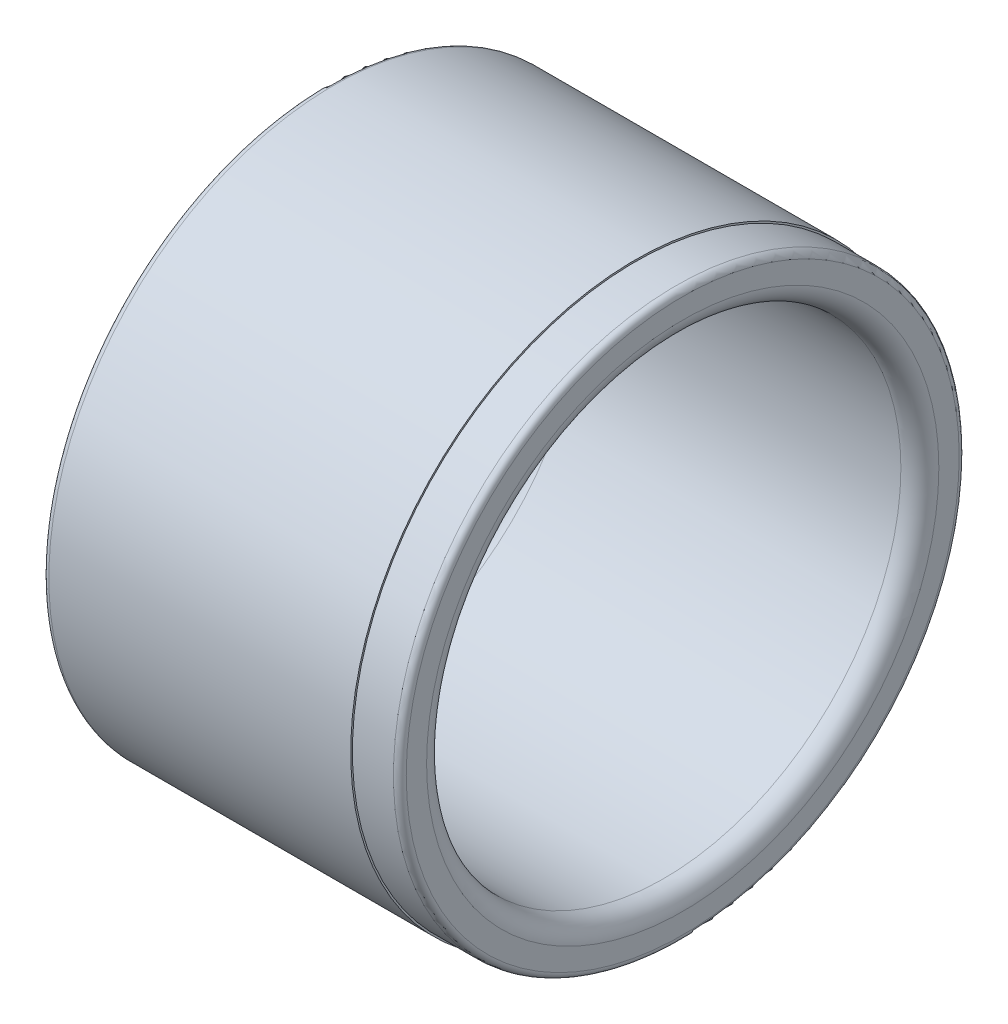
ISO-10303-21;
HEADER;
FILE_DESCRIPTION(('STEP AP214'),'2;1');
FILE_NAME('part.step','',(''),(''),'','','');
FILE_SCHEMA(('AUTOMOTIVE_DESIGN { 1 0 10303 214 1 1 1 1 }'));
ENDSEC;
DATA;
#1=APPLICATION_CONTEXT('core data for automotive mechanical design processes');
#2=APPLICATION_PROTOCOL_DEFINITION('international standard','automotive_design',2000,#1);
#3=PRODUCT_CONTEXT('',#1,'mechanical');
#4=PRODUCT('Part','Part','',(#3));
#5=PRODUCT_RELATED_PRODUCT_CATEGORY('part','',(#4));
#6=PRODUCT_DEFINITION_FORMATION('','',#4);
#7=PRODUCT_DEFINITION_CONTEXT('part definition',#1,'design');
#8=PRODUCT_DEFINITION('design','',#6,#7);
#9=PRODUCT_DEFINITION_SHAPE('','',#8);
#10=(LENGTH_UNIT() NAMED_UNIT(*) SI_UNIT(.MILLI.,.METRE.));
#11=(NAMED_UNIT(*) PLANE_ANGLE_UNIT() SI_UNIT($,.RADIAN.));
#12=(NAMED_UNIT(*) SI_UNIT($,.STERADIAN.) SOLID_ANGLE_UNIT());
#13=UNCERTAINTY_MEASURE_WITH_UNIT(LENGTH_MEASURE(1.E-05),#10,'distance_accuracy_value','');
#14=(GEOMETRIC_REPRESENTATION_CONTEXT(3) GLOBAL_UNCERTAINTY_ASSIGNED_CONTEXT((#13)) GLOBAL_UNIT_ASSIGNED_CONTEXT((#10,
#11,#12)) REPRESENTATION_CONTEXT('',''));
#15=CARTESIAN_POINT('',(0.,0.,0.));
#16=DIRECTION('',(0.,0.,1.));
#17=DIRECTION('',(1.,0.,0.));
#18=AXIS2_PLACEMENT_3D('',#15,#16,#17);
#19=CARTESIAN_POINT('',(0.27,0.,0.));
#20=DIRECTION('',(1.,0.,0.));
#21=DIRECTION('',(0.,0.,-1.));
#22=AXIS2_PLACEMENT_3D('',#19,#20,#21);
#23=TOROIDAL_SURFACE('',#22,11.73,0.27);
#24=CARTESIAN_POINT('',(0.27,0.,0.));
#25=DIRECTION('',(1.,0.,0.));
#26=DIRECTION('',(0.,0.,-1.));
#27=AXIS2_PLACEMENT_3D('',#24,#25,#26);
#28=CIRCLE('',#27,12.);
#29=CARTESIAN_POINT('',(0.27,0.,-12.));
#30=VERTEX_POINT('',#29);
#31=EDGE_CURVE('E11',#30,#30,#28,.T.);
#32=ORIENTED_EDGE('',*,*,#31,.F.);
#33=EDGE_LOOP('',(#32));
#34=FACE_BOUND('',#33,.T.);
#35=CARTESIAN_POINT('',(0.,0.,0.));
#36=DIRECTION('',(1.,0.,0.));
#37=DIRECTION('',(0.,0.,-1.));
#38=AXIS2_PLACEMENT_3D('',#35,#36,#37);
#39=CIRCLE('',#38,11.73);
#40=CARTESIAN_POINT('',(0.,0.,-11.73));
#41=VERTEX_POINT('',#40);
#42=EDGE_CURVE('E79',#41,#41,#39,.T.);
#43=ORIENTED_EDGE('',*,*,#42,.T.);
#44=EDGE_LOOP('',(#43));
#45=FACE_BOUND('',#44,.T.);
#46=ADVANCED_FACE('F16',(#34,#45),#23,.T.);
#47=CARTESIAN_POINT('',(15.,0.,0.));
#48=DIRECTION('',(1.,0.,0.));
#49=DIRECTION('',(0.,0.,-1.));
#50=AXIS2_PLACEMENT_3D('',#47,#48,#49);
#51=CYLINDRICAL_SURFACE('',#50,12.);
#52=CARTESIAN_POINT('',(13.,0.,0.));
#53=DIRECTION('',(1.,0.,0.));
#54=DIRECTION('',(0.,0.,-1.));
#55=AXIS2_PLACEMENT_3D('',#52,#53,#54);
#56=CIRCLE('',#55,12.);
#57=CARTESIAN_POINT('',(13.,0.,-12.));
#58=VERTEX_POINT('',#57);
#59=EDGE_CURVE('E25',#58,#58,#56,.T.);
#60=ORIENTED_EDGE('',*,*,#59,.F.);
#61=EDGE_LOOP('',(#60));
#62=FACE_BOUND('',#61,.T.);
#63=ORIENTED_EDGE('',*,*,#31,.T.);
#64=EDGE_LOOP('',(#63));
#65=FACE_BOUND('',#64,.T.);
#66=ADVANCED_FACE('F115',(#62,#65),#51,.T.);
#67=CARTESIAN_POINT('',(13.,11.928,0.));
#68=DIRECTION('',(1.,0.,0.));
#69=DIRECTION('',(0.,1.,0.));
#70=AXIS2_PLACEMENT_3D('',#67,#68,#69);
#71=PLANE('',#70);
#72=CARTESIAN_POINT('',(13.,0.,0.));
#73=DIRECTION('',(1.,0.,0.));
#74=DIRECTION('',(0.,0.,-1.));
#75=AXIS2_PLACEMENT_3D('',#72,#73,#74);
#76=CIRCLE('',#75,11.928);
#77=CARTESIAN_POINT('',(13.,0.,-11.928));
#78=VERTEX_POINT('',#77);
#79=EDGE_CURVE('E19',#78,#78,#76,.T.);
#80=ORIENTED_EDGE('',*,*,#79,.F.);
#81=EDGE_LOOP('',(#80));
#82=FACE_BOUND('',#81,.T.);
#83=ORIENTED_EDGE('',*,*,#59,.T.);
#84=EDGE_LOOP('',(#83));
#85=FACE_BOUND('',#84,.T.);
#86=ADVANCED_FACE('F113',(#82,#85),#71,.T.);
#87=CARTESIAN_POINT('',(15.,0.,0.));
#88=DIRECTION('',(1.,0.,0.));
#89=DIRECTION('',(0.,0.,-1.));
#90=AXIS2_PLACEMENT_3D('',#87,#88,#89);
#91=CYLINDRICAL_SURFACE('',#90,11.928);
#92=CARTESIAN_POINT('',(14.73,0.,0.));
#93=DIRECTION('',(1.,0.,0.));
#94=DIRECTION('',(0.,0.,-1.));
#95=AXIS2_PLACEMENT_3D('',#92,#93,#94);
#96=CIRCLE('',#95,11.928);
#97=CARTESIAN_POINT('',(14.73,0.,-11.928));
#98=VERTEX_POINT('',#97);
#99=EDGE_CURVE('E100',#98,#98,#96,.T.);
#100=ORIENTED_EDGE('',*,*,#99,.F.);
#101=EDGE_LOOP('',(#100));
#102=FACE_BOUND('',#101,.T.);
#103=ORIENTED_EDGE('',*,*,#79,.T.);
#104=EDGE_LOOP('',(#103));
#105=FACE_BOUND('',#104,.T.);
#106=ADVANCED_FACE('F111',(#102,#105),#91,.T.);
#107=CARTESIAN_POINT('',(14.73,0.,0.));
#108=DIRECTION('',(1.,0.,0.));
#109=DIRECTION('',(0.,0.,-1.));
#110=AXIS2_PLACEMENT_3D('',#107,#108,#109);
#111=TOROIDAL_SURFACE('',#110,11.658,0.27);
#112=CARTESIAN_POINT('',(15.,0.,0.));
#113=DIRECTION('',(1.,0.,0.));
#114=DIRECTION('',(0.,0.,-1.));
#115=AXIS2_PLACEMENT_3D('',#112,#113,#114);
#116=CIRCLE('',#115,11.658);
#117=CARTESIAN_POINT('',(15.,0.,-11.658));
#118=VERTEX_POINT('',#117);
#119=EDGE_CURVE('E97',#118,#118,#116,.T.);
#120=ORIENTED_EDGE('',*,*,#119,.F.);
#121=EDGE_LOOP('',(#120));
#122=FACE_BOUND('',#121,.T.);
#123=ORIENTED_EDGE('',*,*,#99,.T.);
#124=EDGE_LOOP('',(#123));
#125=FACE_BOUND('',#124,.T.);
#126=ADVANCED_FACE('F121',(#122,#125),#111,.T.);
#127=CARTESIAN_POINT('',(15.,10.8,0.));
#128=DIRECTION('',(1.,0.,0.));
#129=DIRECTION('',(0.,1.,0.));
#130=AXIS2_PLACEMENT_3D('',#127,#128,#129);
#131=PLANE('',#130);
#132=CARTESIAN_POINT('',(15.,0.,0.));
#133=DIRECTION('',(1.,0.,0.));
#134=DIRECTION('',(0.,0.,-1.));
#135=AXIS2_PLACEMENT_3D('',#132,#133,#134);
#136=CIRCLE('',#135,10.8);
#137=CARTESIAN_POINT('',(15.,0.,-10.8));
#138=VERTEX_POINT('',#137);
#139=EDGE_CURVE('E95',#138,#138,#136,.T.);
#140=ORIENTED_EDGE('',*,*,#139,.F.);
#141=EDGE_LOOP('',(#140));
#142=FACE_BOUND('',#141,.T.);
#143=ORIENTED_EDGE('',*,*,#119,.T.);
#144=EDGE_LOOP('',(#143));
#145=FACE_BOUND('',#144,.T.);
#146=ADVANCED_FACE('F148',(#142,#145),#131,.T.);
#147=CARTESIAN_POINT('',(14.2,0.,0.));
#148=DIRECTION('',(1.,0.,0.));
#149=DIRECTION('',(0.,0.,-1.));
#150=AXIS2_PLACEMENT_3D('',#147,#148,#149);
#151=TOROIDAL_SURFACE('',#150,10.8,0.8);
#152=CARTESIAN_POINT('',(14.2,0.,0.));
#153=DIRECTION('',(1.,0.,0.));
#154=DIRECTION('',(0.,0.,-1.));
#155=AXIS2_PLACEMENT_3D('',#152,#153,#154);
#156=CIRCLE('',#155,10.);
#157=CARTESIAN_POINT('',(14.2,0.,-10.));
#158=VERTEX_POINT('',#157);
#159=EDGE_CURVE('E90',#158,#158,#156,.T.);
#160=ORIENTED_EDGE('',*,*,#159,.F.);
#161=EDGE_LOOP('',(#160));
#162=FACE_BOUND('',#161,.T.);
#163=ORIENTED_EDGE('',*,*,#139,.T.);
#164=EDGE_LOOP('',(#163));
#165=FACE_BOUND('',#164,.T.);
#166=ADVANCED_FACE('F144',(#162,#165),#151,.T.);
#167=CARTESIAN_POINT('',(15.,0.,0.));
#168=DIRECTION('',(1.,0.,0.));
#169=DIRECTION('',(0.,0.,-1.));
#170=AXIS2_PLACEMENT_3D('',#167,#168,#169);
#171=CYLINDRICAL_SURFACE('',#170,10.);
#172=CARTESIAN_POINT('',(0.8,0.,0.));
#173=DIRECTION('',(1.,0.,0.));
#174=DIRECTION('',(0.,0.,-1.));
#175=AXIS2_PLACEMENT_3D('',#172,#173,#174);
#176=CIRCLE('',#175,10.);
#177=CARTESIAN_POINT('',(0.8,0.,-10.));
#178=VERTEX_POINT('',#177);
#179=EDGE_CURVE('E85',#178,#178,#176,.T.);
#180=ORIENTED_EDGE('',*,*,#179,.F.);
#181=EDGE_LOOP('',(#180));
#182=FACE_BOUND('',#181,.T.);
#183=ORIENTED_EDGE('',*,*,#159,.T.);
#184=EDGE_LOOP('',(#183));
#185=FACE_BOUND('',#184,.T.);
#186=ADVANCED_FACE('F140',(#182,#185),#171,.F.);
#187=CARTESIAN_POINT('',(0.8,0.,0.));
#188=DIRECTION('',(1.,0.,0.));
#189=DIRECTION('',(0.,0.,-1.));
#190=AXIS2_PLACEMENT_3D('',#187,#188,#189);
#191=TOROIDAL_SURFACE('',#190,10.8,0.8);
#192=CARTESIAN_POINT('',(0.,0.,0.));
#193=DIRECTION('',(1.,0.,0.));
#194=DIRECTION('',(0.,0.,-1.));
#195=AXIS2_PLACEMENT_3D('',#192,#193,#194);
#196=CIRCLE('',#195,10.8);
#197=CARTESIAN_POINT('',(0.,0.,-10.8));
#198=VERTEX_POINT('',#197);
#199=EDGE_CURVE('E75',#198,#198,#196,.T.);
#200=ORIENTED_EDGE('',*,*,#199,.F.);
#201=EDGE_LOOP('',(#200));
#202=FACE_BOUND('',#201,.T.);
#203=ORIENTED_EDGE('',*,*,#179,.T.);
#204=EDGE_LOOP('',(#203));
#205=FACE_BOUND('',#204,.T.);
#206=ADVANCED_FACE('F135',(#202,#205),#191,.T.);
#207=CARTESIAN_POINT('',(0.,11.73,0.));
#208=DIRECTION('',(-1.,0.,0.));
#209=DIRECTION('',(0.,0.,1.));
#210=AXIS2_PLACEMENT_3D('',#207,#208,#209);
#211=PLANE('',#210);
#212=ORIENTED_EDGE('',*,*,#42,.F.);
#213=EDGE_LOOP('',(#212));
#214=FACE_BOUND('',#213,.T.);
#215=ORIENTED_EDGE('',*,*,#199,.T.);
#216=EDGE_LOOP('',(#215));
#217=FACE_BOUND('',#216,.T.);
#218=ADVANCED_FACE('F76',(#214,#217),#211,.T.);
#219=CLOSED_SHELL('',(#46,#66,#86,#106,#126,#146,#166,#186,#206,#218));
#220=MANIFOLD_SOLID_BREP('B1',#219);
#221=ADVANCED_BREP_SHAPE_REPRESENTATION('',(#18,#220),#14);
#222=SHAPE_DEFINITION_REPRESENTATION(#9,#221);
ENDSEC;
END-ISO-10303-21;
